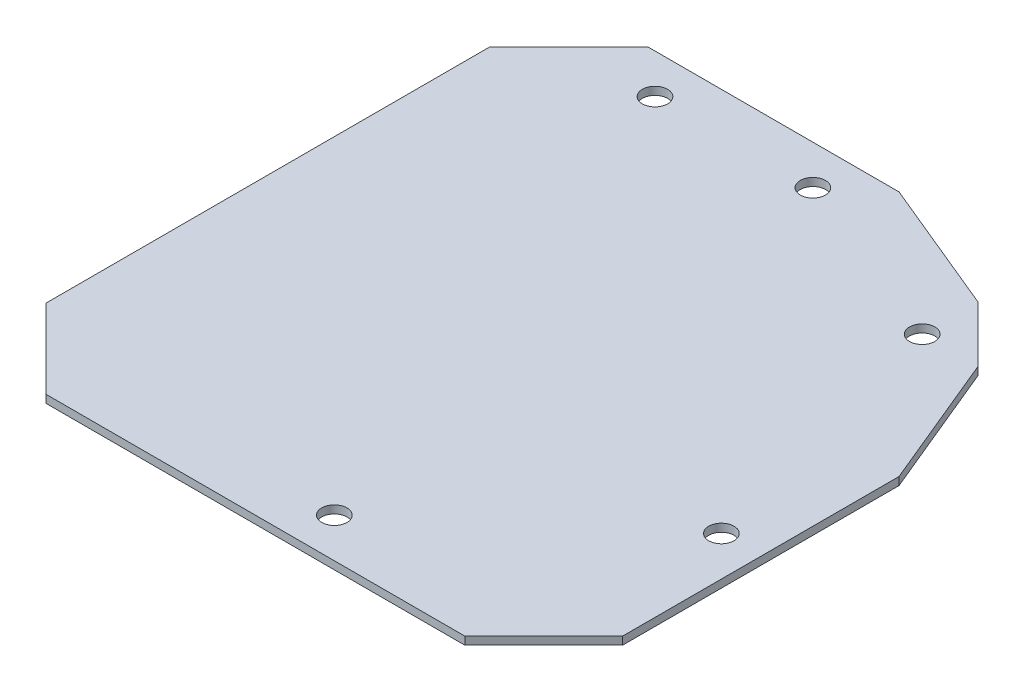
ISO-10303-21;
HEADER;
FILE_DESCRIPTION(('STEP AP214'),'2;1');
FILE_NAME('part.step','',(''),(''),'','','');
FILE_SCHEMA(('AUTOMOTIVE_DESIGN { 1 0 10303 214 1 1 1 1 }'));
ENDSEC;
DATA;
#1=APPLICATION_CONTEXT('core data for automotive mechanical design processes');
#2=APPLICATION_PROTOCOL_DEFINITION('international standard','automotive_design',2000,#1);
#3=PRODUCT_CONTEXT('',#1,'mechanical');
#4=PRODUCT('Part','Part','',(#3));
#5=PRODUCT_RELATED_PRODUCT_CATEGORY('part','',(#4));
#6=PRODUCT_DEFINITION_FORMATION('','',#4);
#7=PRODUCT_DEFINITION_CONTEXT('part definition',#1,'design');
#8=PRODUCT_DEFINITION('design','',#6,#7);
#9=PRODUCT_DEFINITION_SHAPE('','',#8);
#10=(LENGTH_UNIT() NAMED_UNIT(*) SI_UNIT(.MILLI.,.METRE.));
#11=(NAMED_UNIT(*) PLANE_ANGLE_UNIT() SI_UNIT($,.RADIAN.));
#12=(NAMED_UNIT(*) SI_UNIT($,.STERADIAN.) SOLID_ANGLE_UNIT());
#13=UNCERTAINTY_MEASURE_WITH_UNIT(LENGTH_MEASURE(1.E-05),#10,'distance_accuracy_value','');
#14=(GEOMETRIC_REPRESENTATION_CONTEXT(3) GLOBAL_UNCERTAINTY_ASSIGNED_CONTEXT((#13)) GLOBAL_UNIT_ASSIGNED_CONTEXT((#10,
#11,#12)) REPRESENTATION_CONTEXT('',''));
#15=CARTESIAN_POINT('',(0.,0.,0.));
#16=DIRECTION('',(0.,0.,1.));
#17=DIRECTION('',(1.,0.,0.));
#18=AXIS2_PLACEMENT_3D('',#15,#16,#17);
#19=CARTESIAN_POINT('',(0.,1.,0.));
#20=DIRECTION('',(0.,0.,-1.));
#21=DIRECTION('',(-1.,0.,0.));
#22=AXIS2_PLACEMENT_3D('',#19,#20,#21);
#23=PLANE('',#22);
#24=DIRECTION('',(1.,0.,0.));
#25=VECTOR('',#24,1.);
#26=CARTESIAN_POINT('',(0.,1.,0.));
#27=LINE('',#26,#25);
#28=CARTESIAN_POINT('',(-10.,1.,0.));
#29=VERTEX_POINT('',#28);
#30=CARTESIAN_POINT('',(43.0330085889908,1.,0.));
#31=VERTEX_POINT('',#30);
#32=EDGE_CURVE('E194',#29,#31,#27,.T.);
#33=ORIENTED_EDGE('',*,*,#32,.F.);
#34=DIRECTION('',(0.,-1.,0.));
#35=VECTOR('',#34,1.);
#36=CARTESIAN_POINT('',(-10.,0.,0.));
#37=LINE('',#36,#35);
#38=CARTESIAN_POINT('',(-10.,0.,0.));
#39=VERTEX_POINT('',#38);
#40=EDGE_CURVE('E169',#29,#39,#37,.T.);
#41=ORIENTED_EDGE('',*,*,#40,.T.);
#42=DIRECTION('',(1.,0.,0.));
#43=VECTOR('',#42,1.);
#44=CARTESIAN_POINT('',(0.,0.,0.));
#45=LINE('',#44,#43);
#46=CARTESIAN_POINT('',(43.0330085889908,0.,0.));
#47=VERTEX_POINT('',#46);
#48=EDGE_CURVE('E123',#39,#47,#45,.T.);
#49=ORIENTED_EDGE('',*,*,#48,.T.);
#50=DIRECTION('',(0.,1.,0.));
#51=VECTOR('',#50,1.);
#52=CARTESIAN_POINT('',(43.0330085889908,1.,0.));
#53=LINE('',#52,#51);
#54=EDGE_CURVE('E168',#47,#31,#53,.T.);
#55=ORIENTED_EDGE('',*,*,#54,.T.);
#56=EDGE_LOOP('',(#33,#41,#49,#55));
#57=FACE_BOUND('',#56,.T.);
#58=ADVANCED_FACE('F43',(#57),#23,.F.);
#59=CARTESIAN_POINT('',(53.0330085889908,1.,0.));
#60=DIRECTION('',(-1.,0.,0.));
#61=DIRECTION('',(0.,0.,1.));
#62=AXIS2_PLACEMENT_3D('',#59,#60,#61);
#63=PLANE('',#62);
#64=DIRECTION('',(0.,0.,-1.));
#65=VECTOR('',#64,1.);
#66=CARTESIAN_POINT('',(53.0330085889908,0.,0.));
#67=LINE('',#66,#65);
#68=CARTESIAN_POINT('',(53.0330085889908,0.,-10.));
#69=VERTEX_POINT('',#68);
#70=CARTESIAN_POINT('',(53.0330085889908,0.,-44.9999999999999));
#71=VERTEX_POINT('',#70);
#72=EDGE_CURVE('E233',#69,#71,#67,.T.);
#73=ORIENTED_EDGE('',*,*,#72,.T.);
#74=DIRECTION('',(0.,1.,0.));
#75=VECTOR('',#74,1.);
#76=CARTESIAN_POINT('',(53.0330085889908,1.,-44.9999999999999));
#77=LINE('',#76,#75);
#78=CARTESIAN_POINT('',(53.0330085889908,1.,-44.9999999999999));
#79=VERTEX_POINT('',#78);
#80=EDGE_CURVE('E165',#71,#79,#77,.T.);
#81=ORIENTED_EDGE('',*,*,#80,.T.);
#82=DIRECTION('',(0.,0.,-1.));
#83=VECTOR('',#82,1.);
#84=CARTESIAN_POINT('',(53.0330085889908,1.,0.));
#85=LINE('',#84,#83);
#86=CARTESIAN_POINT('',(53.0330085889908,1.,-10.));
#87=VERTEX_POINT('',#86);
#88=EDGE_CURVE('E146',#87,#79,#85,.T.);
#89=ORIENTED_EDGE('',*,*,#88,.F.);
#90=DIRECTION('',(0.,-1.,0.));
#91=VECTOR('',#90,1.);
#92=CARTESIAN_POINT('',(53.0330085889908,1.,-10.));
#93=LINE('',#92,#91);
#94=EDGE_CURVE('E138',#87,#69,#93,.T.);
#95=ORIENTED_EDGE('',*,*,#94,.T.);
#96=EDGE_LOOP('',(#73,#81,#89,#95));
#97=FACE_BOUND('',#96,.T.);
#98=ADVANCED_FACE('F254',(#97),#63,.F.);
#99=CARTESIAN_POINT('',(53.0330085889908,1.,-55.));
#100=DIRECTION('',(-0.707106781186552,0.,0.707106781186544));
#101=DIRECTION('',(0.707106781186544,0.,0.707106781186552));
#102=AXIS2_PLACEMENT_3D('',#99,#100,#101);
#103=PLANE('',#102);
#104=DIRECTION('',(-0.707106781186544,0.,-0.707106781186551));
#105=VECTOR('',#104,1.);
#106=CARTESIAN_POINT('',(53.0330085889908,0.,-55.));
#107=LINE('',#106,#105);
#108=CARTESIAN_POINT('',(45.9619407771253,0.,-62.0710678118656));
#109=VERTEX_POINT('',#108);
#110=CARTESIAN_POINT('',(38.8908729652603,0.,-69.1421356237307));
#111=VERTEX_POINT('',#110);
#112=EDGE_CURVE('E148',#109,#111,#107,.T.);
#113=ORIENTED_EDGE('',*,*,#112,.T.);
#114=DIRECTION('',(0.,1.,0.));
#115=VECTOR('',#114,1.);
#116=CARTESIAN_POINT('',(38.8908729652603,1.,-69.1421356237307));
#117=LINE('',#116,#115);
#118=CARTESIAN_POINT('',(38.8908729652603,1.,-69.1421356237307));
#119=VERTEX_POINT('',#118);
#120=EDGE_CURVE('E160',#111,#119,#117,.T.);
#121=ORIENTED_EDGE('',*,*,#120,.T.);
#122=DIRECTION('',(-0.707106781186544,0.,-0.707106781186551));
#123=VECTOR('',#122,1.);
#124=CARTESIAN_POINT('',(53.0330085889908,1.,-55.));
#125=LINE('',#124,#123);
#126=CARTESIAN_POINT('',(45.9619407771253,1.,-62.0710678118656));
#127=VERTEX_POINT('',#126);
#128=EDGE_CURVE('E132',#127,#119,#125,.T.);
#129=ORIENTED_EDGE('',*,*,#128,.F.);
#130=DIRECTION('',(0.,-1.,0.));
#131=VECTOR('',#130,1.);
#132=CARTESIAN_POINT('',(45.9619407771253,1.,-62.0710678118656));
#133=LINE('',#132,#131);
#134=EDGE_CURVE('E153',#127,#109,#133,.T.);
#135=ORIENTED_EDGE('',*,*,#134,.T.);
#136=EDGE_LOOP('',(#113,#121,#129,#135));
#137=FACE_BOUND('',#136,.T.);
#138=ADVANCED_FACE('F237',(#137),#103,.F.);
#139=CARTESIAN_POINT('',(0.,1.,0.));
#140=DIRECTION('',(0.,1.,0.));
#141=DIRECTION('',(0.,0.,1.));
#142=AXIS2_PLACEMENT_3D('',#139,#140,#141);
#143=PLANE('',#142);
#144=CARTESIAN_POINT('',(15.9099025766972,0.999999999999999,-71.2132034355964));
#145=DIRECTION('',(0.,1.,0.));
#146=DIRECTION('',(0.,0.,1.));
#147=AXIS2_PLACEMENT_3D('',#144,#145,#146);
#148=CIRCLE('',#147,1.60000000000001);
#149=CARTESIAN_POINT('',(15.9099025766972,0.999999999999999,-69.6132034355964));
#150=VERTEX_POINT('',#149);
#151=EDGE_CURVE('E212',#150,#150,#148,.T.);
#152=ORIENTED_EDGE('',*,*,#151,.F.);
#153=EDGE_LOOP('',(#152));
#154=FACE_BOUND('',#153,.T.);
#155=CARTESIAN_POINT('',(-4.09009742330285,0.999999999999999,-71.2132034355964));
#156=DIRECTION('',(0.,1.,0.));
#157=DIRECTION('',(0.,0.,1.));
#158=AXIS2_PLACEMENT_3D('',#155,#156,#157);
#159=CIRCLE('',#158,1.6);
#160=CARTESIAN_POINT('',(-4.09009742330285,0.999999999999999,-69.6132034355964));
#161=VERTEX_POINT('',#160);
#162=EDGE_CURVE('E220',#161,#161,#159,.T.);
#163=ORIENTED_EDGE('',*,*,#162,.F.);
#164=EDGE_LOOP('',(#163));
#165=FACE_BOUND('',#164,.T.);
#166=CARTESIAN_POINT('',(38.89087296526,1.,-62.0710678118654));
#167=DIRECTION('',(0.,1.,0.));
#168=DIRECTION('',(0.,0.,1.));
#169=AXIS2_PLACEMENT_3D('',#166,#167,#168);
#170=CIRCLE('',#169,1.6);
#171=CARTESIAN_POINT('',(38.89087296526,1.,-60.4710678118654));
#172=VERTEX_POINT('',#171);
#173=EDGE_CURVE('E172',#172,#172,#170,.T.);
#174=ORIENTED_EDGE('',*,*,#173,.F.);
#175=EDGE_LOOP('',(#174));
#176=FACE_BOUND('',#175,.T.);
#177=CARTESIAN_POINT('',(48.0330085889908,1.,-27.5));
#178=DIRECTION('',(0.,1.,0.));
#179=DIRECTION('',(0.,0.,1.));
#180=AXIS2_PLACEMENT_3D('',#177,#178,#179);
#181=CIRCLE('',#180,1.6);
#182=CARTESIAN_POINT('',(48.0330085889908,1.,-25.9));
#183=VERTEX_POINT('',#182);
#184=EDGE_CURVE('E221',#183,#183,#181,.T.);
#185=ORIENTED_EDGE('',*,*,#184,.F.);
#186=EDGE_LOOP('',(#185));
#187=FACE_BOUND('',#186,.T.);
#188=CARTESIAN_POINT('',(21.5165042944954,1.,-5.));
#189=DIRECTION('',(0.,1.,0.));
#190=DIRECTION('',(0.,0.,1.));
#191=AXIS2_PLACEMENT_3D('',#188,#189,#190);
#192=CIRCLE('',#191,1.6);
#193=CARTESIAN_POINT('',(21.5165042944954,1.,-3.4));
#194=VERTEX_POINT('',#193);
#195=EDGE_CURVE('E213',#194,#194,#192,.T.);
#196=ORIENTED_EDGE('',*,*,#195,.F.);
#197=EDGE_LOOP('',(#196));
#198=FACE_BOUND('',#197,.T.);
#199=DIRECTION('',(0.,0.,-1.));
#200=VECTOR('',#199,1.);
#201=CARTESIAN_POINT('',(-20.,1.,0.));
#202=LINE('',#201,#200);
#203=CARTESIAN_POINT('',(-20.,1.,-10.));
#204=VERTEX_POINT('',#203);
#205=CARTESIAN_POINT('',(-20.,1.,-66.2132034355964));
#206=VERTEX_POINT('',#205);
#207=EDGE_CURVE('E193',#204,#206,#202,.T.);
#208=ORIENTED_EDGE('',*,*,#207,.F.);
#209=DIRECTION('',(0.707106781186546,0.,0.707106781186549));
#210=VECTOR('',#209,1.);
#211=CARTESIAN_POINT('',(-5.00000000000002,1.,5.));
#212=LINE('',#211,#210);
#213=EDGE_CURVE('E55',#204,#29,#212,.T.);
#214=ORIENTED_EDGE('',*,*,#213,.T.);
#215=ORIENTED_EDGE('',*,*,#32,.T.);
#216=DIRECTION('',(-0.707106781186548,0.,0.707106781186547));
#217=VECTOR('',#216,1.);
#218=CARTESIAN_POINT('',(21.5165042944954,1.,21.5165042944954));
#219=LINE('',#218,#217);
#220=EDGE_CURVE('E159',#31,#87,#219,.F.);
#221=ORIENTED_EDGE('',*,*,#220,.T.);
#222=ORIENTED_EDGE('',*,*,#88,.T.);
#223=DIRECTION('',(0.382683432365087,0.,0.923879532511288));
#224=VECTOR('',#223,1.);
#225=CARTESIAN_POINT('',(61.1764068711926,1.,-25.3400974233024));
#226=LINE('',#225,#224);
#227=EDGE_CURVE('E140',#79,#127,#226,.F.);
#228=ORIENTED_EDGE('',*,*,#227,.T.);
#229=ORIENTED_EDGE('',*,*,#128,.T.);
#230=DIRECTION('',(0.923879532511286,0.,0.382683432365091));
#231=VECTOR('',#230,1.);
#232=CARTESIAN_POINT('',(30.1408729652602,1.,-72.7665042944953));
#233=LINE('',#232,#231);
#234=CARTESIAN_POINT('',(21.8198051533943,1.,-76.2132034355964));
#235=VERTEX_POINT('',#234);
#236=EDGE_CURVE('E130',#119,#235,#233,.F.);
#237=ORIENTED_EDGE('',*,*,#236,.T.);
#238=DIRECTION('',(1.,0.,0.));
#239=VECTOR('',#238,1.);
#240=CARTESIAN_POINT('',(0.,1.,-76.2132034355964));
#241=LINE('',#240,#239);
#242=CARTESIAN_POINT('',(-9.99999999999996,1.,-76.2132034355964));
#243=VERTEX_POINT('',#242);
#244=EDGE_CURVE('E118',#243,#235,#241,.T.);
#245=ORIENTED_EDGE('',*,*,#244,.F.);
#246=DIRECTION('',(-0.707106781186549,0.,0.707106781186546));
#247=VECTOR('',#246,1.);
#248=CARTESIAN_POINT('',(-43.1066017177982,1.,-43.1066017177984));
#249=LINE('',#248,#247);
#250=EDGE_CURVE('E63',#243,#206,#249,.T.);
#251=ORIENTED_EDGE('',*,*,#250,.T.);
#252=EDGE_LOOP('',(#208,#214,#215,#221,#222,#228,#229,#237,#245,#251));
#253=FACE_BOUND('',#252,.T.);
#254=ADVANCED_FACE('F131',(#154,#165,#176,#187,#198,#253),#143,.T.);
#255=CARTESIAN_POINT('',(0.,0.,0.));
#256=DIRECTION('',(0.,1.,0.));
#257=DIRECTION('',(0.,0.,1.));
#258=AXIS2_PLACEMENT_3D('',#255,#256,#257);
#259=PLANE('',#258);
#260=CARTESIAN_POINT('',(15.9099025766972,0.,-71.2132034355964));
#261=DIRECTION('',(0.,-1.,0.));
#262=DIRECTION('',(0.,0.,-1.));
#263=AXIS2_PLACEMENT_3D('',#260,#261,#262);
#264=CIRCLE('',#263,1.60000000000001);
#265=CARTESIAN_POINT('',(15.9099025766972,0.,-72.8132034355964));
#266=VERTEX_POINT('',#265);
#267=EDGE_CURVE('E420',#266,#266,#264,.T.);
#268=ORIENTED_EDGE('',*,*,#267,.F.);
#269=EDGE_LOOP('',(#268));
#270=FACE_BOUND('',#269,.T.);
#271=CARTESIAN_POINT('',(-4.09009742330285,0.,-71.2132034355964));
#272=DIRECTION('',(0.,-1.,0.));
#273=DIRECTION('',(0.,0.,-1.));
#274=AXIS2_PLACEMENT_3D('',#271,#272,#273);
#275=CIRCLE('',#274,1.6);
#276=CARTESIAN_POINT('',(-4.09009742330285,0.,-72.8132034355964));
#277=VERTEX_POINT('',#276);
#278=EDGE_CURVE('E416',#277,#277,#275,.T.);
#279=ORIENTED_EDGE('',*,*,#278,.F.);
#280=EDGE_LOOP('',(#279));
#281=FACE_BOUND('',#280,.T.);
#282=CARTESIAN_POINT('',(38.89087296526,0.,-62.0710678118654));
#283=DIRECTION('',(0.,1.,0.));
#284=DIRECTION('',(0.,0.,1.));
#285=AXIS2_PLACEMENT_3D('',#282,#283,#284);
#286=CIRCLE('',#285,1.6);
#287=CARTESIAN_POINT('',(38.89087296526,0.,-60.4710678118654));
#288=VERTEX_POINT('',#287);
#289=EDGE_CURVE('E180',#288,#288,#286,.T.);
#290=ORIENTED_EDGE('',*,*,#289,.T.);
#291=EDGE_LOOP('',(#290));
#292=FACE_BOUND('',#291,.T.);
#293=CARTESIAN_POINT('',(48.0330085889908,0.,-27.5));
#294=DIRECTION('',(0.,1.,0.));
#295=DIRECTION('',(0.,0.,1.));
#296=AXIS2_PLACEMENT_3D('',#293,#294,#295);
#297=CIRCLE('',#296,1.6);
#298=CARTESIAN_POINT('',(48.0330085889908,0.,-25.9));
#299=VERTEX_POINT('',#298);
#300=EDGE_CURVE('E173',#299,#299,#297,.T.);
#301=ORIENTED_EDGE('',*,*,#300,.T.);
#302=EDGE_LOOP('',(#301));
#303=FACE_BOUND('',#302,.T.);
#304=CARTESIAN_POINT('',(21.5165042944954,0.,-5.));
#305=DIRECTION('',(0.,1.,0.));
#306=DIRECTION('',(0.,0.,1.));
#307=AXIS2_PLACEMENT_3D('',#304,#305,#306);
#308=CIRCLE('',#307,1.6);
#309=CARTESIAN_POINT('',(21.5165042944954,0.,-3.4));
#310=VERTEX_POINT('',#309);
#311=EDGE_CURVE('E167',#310,#310,#308,.T.);
#312=ORIENTED_EDGE('',*,*,#311,.T.);
#313=EDGE_LOOP('',(#312));
#314=FACE_BOUND('',#313,.T.);
#315=ORIENTED_EDGE('',*,*,#48,.F.);
#316=DIRECTION('',(-0.707106781186546,0.,-0.707106781186549));
#317=VECTOR('',#316,1.);
#318=CARTESIAN_POINT('',(-10.,0.,0.));
#319=LINE('',#318,#317);
#320=CARTESIAN_POINT('',(-20.,0.,-10.));
#321=VERTEX_POINT('',#320);
#322=EDGE_CURVE('E183',#39,#321,#319,.T.);
#323=ORIENTED_EDGE('',*,*,#322,.T.);
#324=DIRECTION('',(0.,0.,-1.));
#325=VECTOR('',#324,1.);
#326=CARTESIAN_POINT('',(-20.,0.,0.));
#327=LINE('',#326,#325);
#328=CARTESIAN_POINT('',(-20.,0.,-66.2132034355964));
#329=VERTEX_POINT('',#328);
#330=EDGE_CURVE('E206',#321,#329,#327,.T.);
#331=ORIENTED_EDGE('',*,*,#330,.T.);
#332=DIRECTION('',(0.707106781186549,0.,-0.707106781186546));
#333=VECTOR('',#332,1.);
#334=CARTESIAN_POINT('',(-20.,0.,-66.2132034355964));
#335=LINE('',#334,#333);
#336=CARTESIAN_POINT('',(-9.99999999999996,0.,-76.2132034355964));
#337=VERTEX_POINT('',#336);
#338=EDGE_CURVE('E185',#329,#337,#335,.T.);
#339=ORIENTED_EDGE('',*,*,#338,.T.);
#340=DIRECTION('',(-1.,0.,0.));
#341=VECTOR('',#340,1.);
#342=CARTESIAN_POINT('',(0.,0.,-76.2132034355964));
#343=LINE('',#342,#341);
#344=CARTESIAN_POINT('',(21.8198051533943,0.,-76.2132034355964));
#345=VERTEX_POINT('',#344);
#346=EDGE_CURVE('E126',#345,#337,#343,.T.);
#347=ORIENTED_EDGE('',*,*,#346,.F.);
#348=DIRECTION('',(-0.923879532511286,0.,-0.382683432365091));
#349=VECTOR('',#348,1.);
#350=CARTESIAN_POINT('',(21.8198051533943,0.,-76.2132034355964));
#351=LINE('',#350,#349);
#352=EDGE_CURVE('E137',#345,#111,#351,.F.);
#353=ORIENTED_EDGE('',*,*,#352,.T.);
#354=ORIENTED_EDGE('',*,*,#112,.F.);
#355=DIRECTION('',(-0.382683432365087,0.,-0.923879532511288));
#356=VECTOR('',#355,1.);
#357=CARTESIAN_POINT('',(45.9619407771253,0.,-62.0710678118656));
#358=LINE('',#357,#356);
#359=EDGE_CURVE('E144',#109,#71,#358,.F.);
#360=ORIENTED_EDGE('',*,*,#359,.T.);
#361=ORIENTED_EDGE('',*,*,#72,.F.);
#362=DIRECTION('',(0.707106781186548,0.,-0.707106781186547));
#363=VECTOR('',#362,1.);
#364=CARTESIAN_POINT('',(53.0330085889908,0.,-10.));
#365=LINE('',#364,#363);
#366=EDGE_CURVE('E142',#69,#47,#365,.F.);
#367=ORIENTED_EDGE('',*,*,#366,.T.);
#368=EDGE_LOOP('',(#315,#323,#331,#339,#347,#353,#354,#360,#361,#367));
#369=FACE_BOUND('',#368,.T.);
#370=ADVANCED_FACE('F210',(#270,#281,#292,#303,#314,#369),#259,.F.);
#371=CARTESIAN_POINT('',(0.,10.,-76.2132034355964));
#372=DIRECTION('',(0.,0.,1.));
#373=DIRECTION('',(1.,0.,0.));
#374=AXIS2_PLACEMENT_3D('',#371,#372,#373);
#375=PLANE('',#374);
#376=ORIENTED_EDGE('',*,*,#346,.T.);
#377=DIRECTION('',(0.,1.,0.));
#378=VECTOR('',#377,1.);
#379=CARTESIAN_POINT('',(-9.99999999999996,1.,-76.2132034355964));
#380=LINE('',#379,#378);
#381=EDGE_CURVE('E11',#337,#243,#380,.T.);
#382=ORIENTED_EDGE('',*,*,#381,.T.);
#383=ORIENTED_EDGE('',*,*,#244,.T.);
#384=DIRECTION('',(0.,-1.,0.));
#385=VECTOR('',#384,1.);
#386=CARTESIAN_POINT('',(21.8198051533943,10.,-76.2132034355964));
#387=LINE('',#386,#385);
#388=EDGE_CURVE('E124',#235,#345,#387,.T.);
#389=ORIENTED_EDGE('',*,*,#388,.T.);
#390=EDGE_LOOP('',(#376,#382,#383,#389));
#391=FACE_BOUND('',#390,.T.);
#392=ADVANCED_FACE('F122',(#391),#375,.F.);
#393=CARTESIAN_POINT('',(21.8198051533943,10.,-76.2132034355964));
#394=DIRECTION('',(-0.382683432365091,0.,0.923879532511286));
#395=DIRECTION('',(0.,-1.,0.));
#396=AXIS2_PLACEMENT_3D('',#393,#394,#395);
#397=PLANE('',#396);
#398=ORIENTED_EDGE('',*,*,#236,.F.);
#399=ORIENTED_EDGE('',*,*,#120,.F.);
#400=ORIENTED_EDGE('',*,*,#352,.F.);
#401=ORIENTED_EDGE('',*,*,#388,.F.);
#402=EDGE_LOOP('',(#398,#399,#400,#401));
#403=FACE_BOUND('',#402,.T.);
#404=ADVANCED_FACE('F139',(#403),#397,.F.);
#405=CARTESIAN_POINT('',(45.9619407771253,1.,-62.0710678118656));
#406=DIRECTION('',(-0.923879532511288,0.,0.382683432365087));
#407=DIRECTION('',(0.,-1.,0.));
#408=AXIS2_PLACEMENT_3D('',#405,#406,#407);
#409=PLANE('',#408);
#410=ORIENTED_EDGE('',*,*,#227,.F.);
#411=ORIENTED_EDGE('',*,*,#80,.F.);
#412=ORIENTED_EDGE('',*,*,#359,.F.);
#413=ORIENTED_EDGE('',*,*,#134,.F.);
#414=EDGE_LOOP('',(#410,#411,#412,#413));
#415=FACE_BOUND('',#414,.T.);
#416=ADVANCED_FACE('F269',(#415),#409,.F.);
#417=CARTESIAN_POINT('',(53.0330085889908,1.,-10.));
#418=DIRECTION('',(-0.707106781186547,0.,-0.707106781186548));
#419=DIRECTION('',(0.,-1.,0.));
#420=AXIS2_PLACEMENT_3D('',#417,#418,#419);
#421=PLANE('',#420);
#422=ORIENTED_EDGE('',*,*,#220,.F.);
#423=ORIENTED_EDGE('',*,*,#54,.F.);
#424=ORIENTED_EDGE('',*,*,#366,.F.);
#425=ORIENTED_EDGE('',*,*,#94,.F.);
#426=EDGE_LOOP('',(#422,#423,#424,#425));
#427=FACE_BOUND('',#426,.T.);
#428=ADVANCED_FACE('F273',(#427),#421,.F.);
#429=CARTESIAN_POINT('',(21.5165042944954,-9.,-5.));
#430=DIRECTION('',(0.,1.,0.));
#431=DIRECTION('',(0.,0.,1.));
#432=AXIS2_PLACEMENT_3D('',#429,#430,#431);
#433=CYLINDRICAL_SURFACE('',#432,1.6);
#434=ORIENTED_EDGE('',*,*,#195,.T.);
#435=EDGE_LOOP('',(#434));
#436=FACE_BOUND('',#435,.T.);
#437=ORIENTED_EDGE('',*,*,#311,.F.);
#438=EDGE_LOOP('',(#437));
#439=FACE_BOUND('',#438,.T.);
#440=ADVANCED_FACE('F281',(#436,#439),#433,.F.);
#441=CARTESIAN_POINT('',(48.0330085889908,-9.,-27.5));
#442=DIRECTION('',(0.,1.,0.));
#443=DIRECTION('',(0.,0.,1.));
#444=AXIS2_PLACEMENT_3D('',#441,#442,#443);
#445=CYLINDRICAL_SURFACE('',#444,1.6);
#446=ORIENTED_EDGE('',*,*,#184,.T.);
#447=EDGE_LOOP('',(#446));
#448=FACE_BOUND('',#447,.T.);
#449=ORIENTED_EDGE('',*,*,#300,.F.);
#450=EDGE_LOOP('',(#449));
#451=FACE_BOUND('',#450,.T.);
#452=ADVANCED_FACE('F287',(#448,#451),#445,.F.);
#453=CARTESIAN_POINT('',(38.89087296526,-9.,-62.0710678118654));
#454=DIRECTION('',(0.,1.,0.));
#455=DIRECTION('',(0.,0.,1.));
#456=AXIS2_PLACEMENT_3D('',#453,#454,#455);
#457=CYLINDRICAL_SURFACE('',#456,1.6);
#458=ORIENTED_EDGE('',*,*,#173,.T.);
#459=EDGE_LOOP('',(#458));
#460=FACE_BOUND('',#459,.T.);
#461=ORIENTED_EDGE('',*,*,#289,.F.);
#462=EDGE_LOOP('',(#461));
#463=FACE_BOUND('',#462,.T.);
#464=ADVANCED_FACE('F299',(#460,#463),#457,.F.);
#465=CARTESIAN_POINT('',(-20.,79.793733113209,0.));
#466=DIRECTION('',(-1.,0.,0.));
#467=DIRECTION('',(0.,0.,1.));
#468=AXIS2_PLACEMENT_3D('',#465,#466,#467);
#469=PLANE('',#468);
#470=ORIENTED_EDGE('',*,*,#330,.F.);
#471=DIRECTION('',(0.,1.,0.));
#472=VECTOR('',#471,1.);
#473=CARTESIAN_POINT('',(-20.,1.,-10.));
#474=LINE('',#473,#472);
#475=EDGE_CURVE('E186',#321,#204,#474,.T.);
#476=ORIENTED_EDGE('',*,*,#475,.T.);
#477=ORIENTED_EDGE('',*,*,#207,.T.);
#478=DIRECTION('',(0.,-1.,0.));
#479=VECTOR('',#478,1.);
#480=CARTESIAN_POINT('',(-20.,0.,-66.2132034355964));
#481=LINE('',#480,#479);
#482=EDGE_CURVE('E187',#206,#329,#481,.T.);
#483=ORIENTED_EDGE('',*,*,#482,.T.);
#484=EDGE_LOOP('',(#470,#476,#477,#483));
#485=FACE_BOUND('',#484,.T.);
#486=ADVANCED_FACE('F208',(#485),#469,.T.);
#487=CARTESIAN_POINT('',(-10.,1.,0.));
#488=DIRECTION('',(-0.707106781186549,0.,0.707106781186546));
#489=DIRECTION('',(0.,1.,0.));
#490=AXIS2_PLACEMENT_3D('',#487,#488,#489);
#491=PLANE('',#490);
#492=ORIENTED_EDGE('',*,*,#213,.F.);
#493=ORIENTED_EDGE('',*,*,#475,.F.);
#494=ORIENTED_EDGE('',*,*,#322,.F.);
#495=ORIENTED_EDGE('',*,*,#40,.F.);
#496=EDGE_LOOP('',(#492,#493,#494,#495));
#497=FACE_BOUND('',#496,.T.);
#498=ADVANCED_FACE('F201',(#497),#491,.T.);
#499=CARTESIAN_POINT('',(-20.,79.793733113209,-66.2132034355964));
#500=DIRECTION('',(-0.707106781186546,0.,-0.707106781186549));
#501=DIRECTION('',(0.,1.,0.));
#502=AXIS2_PLACEMENT_3D('',#499,#500,#501);
#503=PLANE('',#502);
#504=ORIENTED_EDGE('',*,*,#250,.F.);
#505=ORIENTED_EDGE('',*,*,#381,.F.);
#506=ORIENTED_EDGE('',*,*,#338,.F.);
#507=ORIENTED_EDGE('',*,*,#482,.F.);
#508=EDGE_LOOP('',(#504,#505,#506,#507));
#509=FACE_BOUND('',#508,.T.);
#510=ADVANCED_FACE('F46',(#509),#503,.T.);
#511=CARTESIAN_POINT('',(-4.09009742330285,10.,-71.2132034355964));
#512=DIRECTION('',(0.,-1.,0.));
#513=DIRECTION('',(0.,0.,-1.));
#514=AXIS2_PLACEMENT_3D('',#511,#512,#513);
#515=CYLINDRICAL_SURFACE('',#514,1.6);
#516=ORIENTED_EDGE('',*,*,#162,.T.);
#517=EDGE_LOOP('',(#516));
#518=FACE_BOUND('',#517,.T.);
#519=ORIENTED_EDGE('',*,*,#278,.T.);
#520=EDGE_LOOP('',(#519));
#521=FACE_BOUND('',#520,.T.);
#522=ADVANCED_FACE('F243',(#518,#521),#515,.F.);
#523=CARTESIAN_POINT('',(15.9099025766972,10.,-71.2132034355964));
#524=DIRECTION('',(0.,-1.,0.));
#525=DIRECTION('',(0.,0.,-1.));
#526=AXIS2_PLACEMENT_3D('',#523,#524,#525);
#527=CYLINDRICAL_SURFACE('',#526,1.60000000000001);
#528=ORIENTED_EDGE('',*,*,#151,.T.);
#529=EDGE_LOOP('',(#528));
#530=FACE_BOUND('',#529,.T.);
#531=ORIENTED_EDGE('',*,*,#267,.T.);
#532=EDGE_LOOP('',(#531));
#533=FACE_BOUND('',#532,.T.);
#534=ADVANCED_FACE('F248',(#530,#533),#527,.F.);
#535=CLOSED_SHELL('',(#58,#98,#138,#254,#370,#392,#404,#416,#428,#440,#452,#464,#486,#498,#510,
#522,#534));
#536=MANIFOLD_SOLID_BREP('B2',#535);
#537=ADVANCED_BREP_SHAPE_REPRESENTATION('',(#18,#536),#14);
#538=SHAPE_DEFINITION_REPRESENTATION(#9,#537);
ENDSEC;
END-ISO-10303-21;
